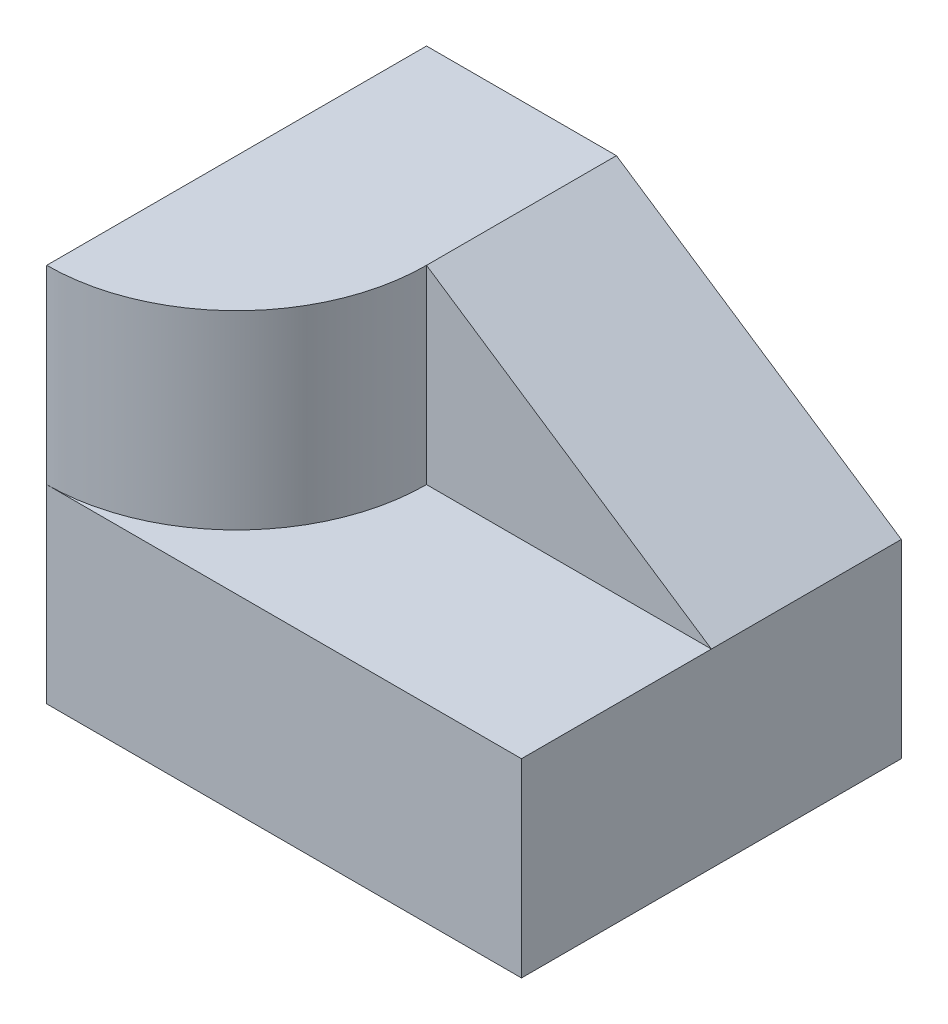
ISO-10303-21;
HEADER;
FILE_DESCRIPTION(('STEP AP214'),'2;1');
FILE_NAME('part.step','',(''),(''),'','','');
FILE_SCHEMA(('AUTOMOTIVE_DESIGN { 1 0 10303 214 1 1 1 1 }'));
ENDSEC;
DATA;
#1=APPLICATION_CONTEXT('core data for automotive mechanical design processes');
#2=APPLICATION_PROTOCOL_DEFINITION('international standard','automotive_design',2000,#1);
#3=PRODUCT_CONTEXT('',#1,'mechanical');
#4=PRODUCT('Part','Part','',(#3));
#5=PRODUCT_RELATED_PRODUCT_CATEGORY('part','',(#4));
#6=PRODUCT_DEFINITION_FORMATION('','',#4);
#7=PRODUCT_DEFINITION_CONTEXT('part definition',#1,'design');
#8=PRODUCT_DEFINITION('design','',#6,#7);
#9=PRODUCT_DEFINITION_SHAPE('','',#8);
#10=(LENGTH_UNIT() NAMED_UNIT(*) SI_UNIT(.MILLI.,.METRE.));
#11=(NAMED_UNIT(*) PLANE_ANGLE_UNIT() SI_UNIT($,.RADIAN.));
#12=(NAMED_UNIT(*) SI_UNIT($,.STERADIAN.) SOLID_ANGLE_UNIT());
#13=UNCERTAINTY_MEASURE_WITH_UNIT(LENGTH_MEASURE(1.E-05),#10,'distance_accuracy_value','');
#14=(GEOMETRIC_REPRESENTATION_CONTEXT(3) GLOBAL_UNCERTAINTY_ASSIGNED_CONTEXT((#13)) GLOBAL_UNIT_ASSIGNED_CONTEXT((#10,
#11,#12)) REPRESENTATION_CONTEXT('',''));
#15=CARTESIAN_POINT('',(0.,0.,0.));
#16=DIRECTION('',(0.,0.,1.));
#17=DIRECTION('',(1.,0.,0.));
#18=AXIS2_PLACEMENT_3D('',#15,#16,#17);
#19=CARTESIAN_POINT('',(0.,10.,0.));
#20=DIRECTION('',(1.,0.,0.));
#21=DIRECTION('',(0.,0.,-1.));
#22=AXIS2_PLACEMENT_3D('',#19,#20,#21);
#23=PLANE('',#22);
#24=DIRECTION('',(0.,0.,1.));
#25=VECTOR('',#24,1.);
#26=CARTESIAN_POINT('',(0.,0.,0.));
#27=LINE('',#26,#25);
#28=CARTESIAN_POINT('',(0.,0.,-20.));
#29=VERTEX_POINT('',#28);
#30=CARTESIAN_POINT('',(0.,0.,0.));
#31=VERTEX_POINT('',#30);
#32=EDGE_CURVE('E87',#29,#31,#27,.T.);
#33=ORIENTED_EDGE('',*,*,#32,.T.);
#34=DIRECTION('',(0.,-1.,0.));
#35=VECTOR('',#34,1.);
#36=CARTESIAN_POINT('',(0.,10.,0.));
#37=LINE('',#36,#35);
#38=CARTESIAN_POINT('',(0.,10.,0.));
#39=VERTEX_POINT('',#38);
#40=EDGE_CURVE('E11',#39,#31,#37,.T.);
#41=ORIENTED_EDGE('',*,*,#40,.F.);
#42=DIRECTION('',(0.,-1.,0.));
#43=VECTOR('',#42,1.);
#44=CARTESIAN_POINT('',(0.,20.,0.));
#45=LINE('',#44,#43);
#46=CARTESIAN_POINT('',(0.,20.,0.));
#47=VERTEX_POINT('',#46);
#48=EDGE_CURVE('E96',#47,#39,#45,.T.);
#49=ORIENTED_EDGE('',*,*,#48,.F.);
#50=DIRECTION('',(0.,0.,1.));
#51=VECTOR('',#50,1.);
#52=CARTESIAN_POINT('',(0.,20.,-20.));
#53=LINE('',#52,#51);
#54=CARTESIAN_POINT('',(0.,20.,-20.));
#55=VERTEX_POINT('',#54);
#56=EDGE_CURVE('E90',#55,#47,#53,.T.);
#57=ORIENTED_EDGE('',*,*,#56,.F.);
#58=DIRECTION('',(0.,-1.,0.));
#59=VECTOR('',#58,1.);
#60=CARTESIAN_POINT('',(0.,10.,-20.));
#61=LINE('',#60,#59);
#62=EDGE_CURVE('E77',#55,#29,#61,.T.);
#63=ORIENTED_EDGE('',*,*,#62,.T.);
#64=EDGE_LOOP('',(#33,#41,#49,#57,#63));
#65=FACE_BOUND('',#64,.T.);
#66=ADVANCED_FACE('F33',(#65),#23,.F.);
#67=CARTESIAN_POINT('',(0.,10.,0.));
#68=DIRECTION('',(0.,0.,-1.));
#69=DIRECTION('',(-1.,0.,0.));
#70=AXIS2_PLACEMENT_3D('',#67,#68,#69);
#71=PLANE('',#70);
#72=DIRECTION('',(1.,0.,0.));
#73=VECTOR('',#72,1.);
#74=CARTESIAN_POINT('',(0.,0.,0.));
#75=LINE('',#74,#73);
#76=CARTESIAN_POINT('',(25.,0.,0.));
#77=VERTEX_POINT('',#76);
#78=EDGE_CURVE('E95',#31,#77,#75,.T.);
#79=ORIENTED_EDGE('',*,*,#78,.T.);
#80=DIRECTION('',(0.,-1.,0.));
#81=VECTOR('',#80,1.);
#82=CARTESIAN_POINT('',(25.,10.,0.));
#83=LINE('',#82,#81);
#84=CARTESIAN_POINT('',(25.,10.,0.));
#85=VERTEX_POINT('',#84);
#86=EDGE_CURVE('E41',#85,#77,#83,.T.);
#87=ORIENTED_EDGE('',*,*,#86,.F.);
#88=DIRECTION('',(1.,0.,0.));
#89=VECTOR('',#88,1.);
#90=CARTESIAN_POINT('',(0.,10.,0.));
#91=LINE('',#90,#89);
#92=EDGE_CURVE('E49',#39,#85,#91,.T.);
#93=ORIENTED_EDGE('',*,*,#92,.F.);
#94=ORIENTED_EDGE('',*,*,#40,.T.);
#95=EDGE_LOOP('',(#79,#87,#93,#94));
#96=FACE_BOUND('',#95,.T.);
#97=ADVANCED_FACE('F110',(#96),#71,.F.);
#98=CARTESIAN_POINT('',(25.,10.,0.));
#99=DIRECTION('',(-1.,0.,0.));
#100=DIRECTION('',(0.,0.,1.));
#101=AXIS2_PLACEMENT_3D('',#98,#99,#100);
#102=PLANE('',#101);
#103=DIRECTION('',(0.,0.,-1.));
#104=VECTOR('',#103,1.);
#105=CARTESIAN_POINT('',(25.,0.,0.));
#106=LINE('',#105,#104);
#107=CARTESIAN_POINT('',(25.,0.,-20.));
#108=VERTEX_POINT('',#107);
#109=EDGE_CURVE('E66',#77,#108,#106,.T.);
#110=ORIENTED_EDGE('',*,*,#109,.T.);
#111=DIRECTION('',(0.,-1.,0.));
#112=VECTOR('',#111,1.);
#113=CARTESIAN_POINT('',(25.,10.,-20.));
#114=LINE('',#113,#112);
#115=CARTESIAN_POINT('',(25.,10.,-20.));
#116=VERTEX_POINT('',#115);
#117=EDGE_CURVE('E80',#116,#108,#114,.T.);
#118=ORIENTED_EDGE('',*,*,#117,.F.);
#119=DIRECTION('',(0.,0.,-1.));
#120=VECTOR('',#119,1.);
#121=CARTESIAN_POINT('',(25.,10.,-10.));
#122=LINE('',#121,#120);
#123=CARTESIAN_POINT('',(25.,10.,-10.));
#124=VERTEX_POINT('',#123);
#125=EDGE_CURVE('E134',#124,#116,#122,.T.);
#126=ORIENTED_EDGE('',*,*,#125,.F.);
#127=DIRECTION('',(0.,0.,-1.));
#128=VECTOR('',#127,1.);
#129=CARTESIAN_POINT('',(25.,10.,0.));
#130=LINE('',#129,#128);
#131=EDGE_CURVE('E92',#85,#124,#130,.T.);
#132=ORIENTED_EDGE('',*,*,#131,.F.);
#133=ORIENTED_EDGE('',*,*,#86,.T.);
#134=EDGE_LOOP('',(#110,#118,#126,#132,#133));
#135=FACE_BOUND('',#134,.T.);
#136=ADVANCED_FACE('F107',(#135),#102,.F.);
#137=CARTESIAN_POINT('',(0.,10.,-20.));
#138=DIRECTION('',(0.,0.,1.));
#139=DIRECTION('',(1.,0.,0.));
#140=AXIS2_PLACEMENT_3D('',#137,#138,#139);
#141=PLANE('',#140);
#142=DIRECTION('',(-1.,0.,0.));
#143=VECTOR('',#142,1.);
#144=CARTESIAN_POINT('',(0.,0.,-20.));
#145=LINE('',#144,#143);
#146=EDGE_CURVE('E72',#108,#29,#145,.T.);
#147=ORIENTED_EDGE('',*,*,#146,.T.);
#148=ORIENTED_EDGE('',*,*,#62,.F.);
#149=DIRECTION('',(-1.,0.,0.));
#150=VECTOR('',#149,1.);
#151=CARTESIAN_POINT('',(0.,20.,-20.));
#152=LINE('',#151,#150);
#153=CARTESIAN_POINT('',(10.,20.,-20.));
#154=VERTEX_POINT('',#153);
#155=EDGE_CURVE('E129',#154,#55,#152,.T.);
#156=ORIENTED_EDGE('',*,*,#155,.F.);
#157=DIRECTION('',(0.832050294337844,-0.554700196225229,0.));
#158=VECTOR('',#157,1.);
#159=CARTESIAN_POINT('',(25.,10.,-20.));
#160=LINE('',#159,#158);
#161=EDGE_CURVE('E153',#154,#116,#160,.T.);
#162=ORIENTED_EDGE('',*,*,#161,.T.);
#163=ORIENTED_EDGE('',*,*,#117,.T.);
#164=EDGE_LOOP('',(#147,#148,#156,#162,#163));
#165=FACE_BOUND('',#164,.T.);
#166=ADVANCED_FACE('F74',(#165),#141,.F.);
#167=CARTESIAN_POINT('',(0.,10.,0.));
#168=DIRECTION('',(0.,-1.,0.));
#169=DIRECTION('',(0.,0.,-1.));
#170=AXIS2_PLACEMENT_3D('',#167,#168,#169);
#171=PLANE('',#170);
#172=ORIENTED_EDGE('',*,*,#131,.T.);
#173=DIRECTION('',(-1.,0.,0.));
#174=VECTOR('',#173,1.);
#175=CARTESIAN_POINT('',(9.99999999999999,10.,-10.));
#176=LINE('',#175,#174);
#177=CARTESIAN_POINT('',(9.99999999999999,10.,-10.));
#178=VERTEX_POINT('',#177);
#179=EDGE_CURVE('E139',#124,#178,#176,.T.);
#180=ORIENTED_EDGE('',*,*,#179,.T.);
#181=CARTESIAN_POINT('',(0.,10.,-10.));
#182=DIRECTION('',(0.,1.,0.));
#183=DIRECTION('',(0.,0.,-1.));
#184=AXIS2_PLACEMENT_3D('',#181,#182,#183);
#185=CIRCLE('',#184,10.);
#186=EDGE_CURVE('E118',#39,#178,#185,.T.);
#187=ORIENTED_EDGE('',*,*,#186,.F.);
#188=ORIENTED_EDGE('',*,*,#92,.T.);
#189=EDGE_LOOP('',(#172,#180,#187,#188));
#190=FACE_BOUND('',#189,.T.);
#191=ADVANCED_FACE('F137',(#190),#171,.F.);
#192=CARTESIAN_POINT('',(0.,0.,0.));
#193=DIRECTION('',(0.,-1.,0.));
#194=DIRECTION('',(0.,0.,-1.));
#195=AXIS2_PLACEMENT_3D('',#192,#193,#194);
#196=PLANE('',#195);
#197=ORIENTED_EDGE('',*,*,#32,.F.);
#198=ORIENTED_EDGE('',*,*,#146,.F.);
#199=ORIENTED_EDGE('',*,*,#109,.F.);
#200=ORIENTED_EDGE('',*,*,#78,.F.);
#201=EDGE_LOOP('',(#197,#198,#199,#200));
#202=FACE_BOUND('',#201,.T.);
#203=ADVANCED_FACE('F94',(#202),#196,.T.);
#204=CARTESIAN_POINT('',(0.,20.,-10.));
#205=DIRECTION('',(0.,-1.,0.));
#206=DIRECTION('',(0.,0.,-1.));
#207=AXIS2_PLACEMENT_3D('',#204,#205,#206);
#208=CYLINDRICAL_SURFACE('',#207,10.);
#209=ORIENTED_EDGE('',*,*,#186,.T.);
#210=DIRECTION('',(0.,-1.,0.));
#211=VECTOR('',#210,1.);
#212=CARTESIAN_POINT('',(10.,20.,-10.));
#213=LINE('',#212,#211);
#214=CARTESIAN_POINT('',(10.,20.,-10.));
#215=VERTEX_POINT('',#214);
#216=EDGE_CURVE('E100',#215,#178,#213,.T.);
#217=ORIENTED_EDGE('',*,*,#216,.F.);
#218=CARTESIAN_POINT('',(0.,20.,-10.));
#219=DIRECTION('',(0.,1.,0.));
#220=DIRECTION('',(0.,0.,-1.));
#221=AXIS2_PLACEMENT_3D('',#218,#219,#220);
#222=CIRCLE('',#221,10.);
#223=EDGE_CURVE('E120',#47,#215,#222,.T.);
#224=ORIENTED_EDGE('',*,*,#223,.F.);
#225=ORIENTED_EDGE('',*,*,#48,.T.);
#226=EDGE_LOOP('',(#209,#217,#224,#225));
#227=FACE_BOUND('',#226,.T.);
#228=ADVANCED_FACE('F115',(#227),#208,.T.);
#229=CARTESIAN_POINT('',(0.,20.,-10.));
#230=DIRECTION('',(0.,-1.,0.));
#231=DIRECTION('',(0.,0.,-1.));
#232=AXIS2_PLACEMENT_3D('',#229,#230,#231);
#233=PLANE('',#232);
#234=ORIENTED_EDGE('',*,*,#155,.T.);
#235=ORIENTED_EDGE('',*,*,#56,.T.);
#236=ORIENTED_EDGE('',*,*,#223,.T.);
#237=DIRECTION('',(0.,0.,-1.));
#238=VECTOR('',#237,1.);
#239=CARTESIAN_POINT('',(10.,20.,-20.));
#240=LINE('',#239,#238);
#241=EDGE_CURVE('E126',#215,#154,#240,.T.);
#242=ORIENTED_EDGE('',*,*,#241,.T.);
#243=EDGE_LOOP('',(#234,#235,#236,#242));
#244=FACE_BOUND('',#243,.T.);
#245=ADVANCED_FACE('F157',(#244),#233,.F.);
#246=CARTESIAN_POINT('',(25.,10.,-10.));
#247=DIRECTION('',(0.554700196225229,0.832050294337844,0.));
#248=DIRECTION('',(-0.832050294337844,0.554700196225229,0.));
#249=AXIS2_PLACEMENT_3D('',#246,#247,#248);
#250=PLANE('',#249);
#251=ORIENTED_EDGE('',*,*,#161,.F.);
#252=ORIENTED_EDGE('',*,*,#241,.F.);
#253=DIRECTION('',(0.832050294337844,-0.554700196225229,0.));
#254=VECTOR('',#253,1.);
#255=CARTESIAN_POINT('',(25.,10.,-10.));
#256=LINE('',#255,#254);
#257=EDGE_CURVE('E155',#215,#124,#256,.T.);
#258=ORIENTED_EDGE('',*,*,#257,.T.);
#259=ORIENTED_EDGE('',*,*,#125,.T.);
#260=EDGE_LOOP('',(#251,#252,#258,#259));
#261=FACE_BOUND('',#260,.T.);
#262=ADVANCED_FACE('F154',(#261),#250,.T.);
#263=CARTESIAN_POINT('',(0.,0.,-10.));
#264=DIRECTION('',(0.,0.,1.));
#265=DIRECTION('',(1.,0.,0.));
#266=AXIS2_PLACEMENT_3D('',#263,#264,#265);
#267=PLANE('',#266);
#268=ORIENTED_EDGE('',*,*,#257,.F.);
#269=ORIENTED_EDGE('',*,*,#216,.T.);
#270=ORIENTED_EDGE('',*,*,#179,.F.);
#271=EDGE_LOOP('',(#268,#269,#270));
#272=FACE_BOUND('',#271,.T.);
#273=ADVANCED_FACE('F161',(#272),#267,.T.);
#274=CLOSED_SHELL('',(#66,#97,#136,#166,#191,#203,#228,#245,#262,#273));
#275=MANIFOLD_SOLID_BREP('B2',#274);
#276=ADVANCED_BREP_SHAPE_REPRESENTATION('',(#18,#275),#14);
#277=SHAPE_DEFINITION_REPRESENTATION(#9,#276);
ENDSEC;
END-ISO-10303-21;
